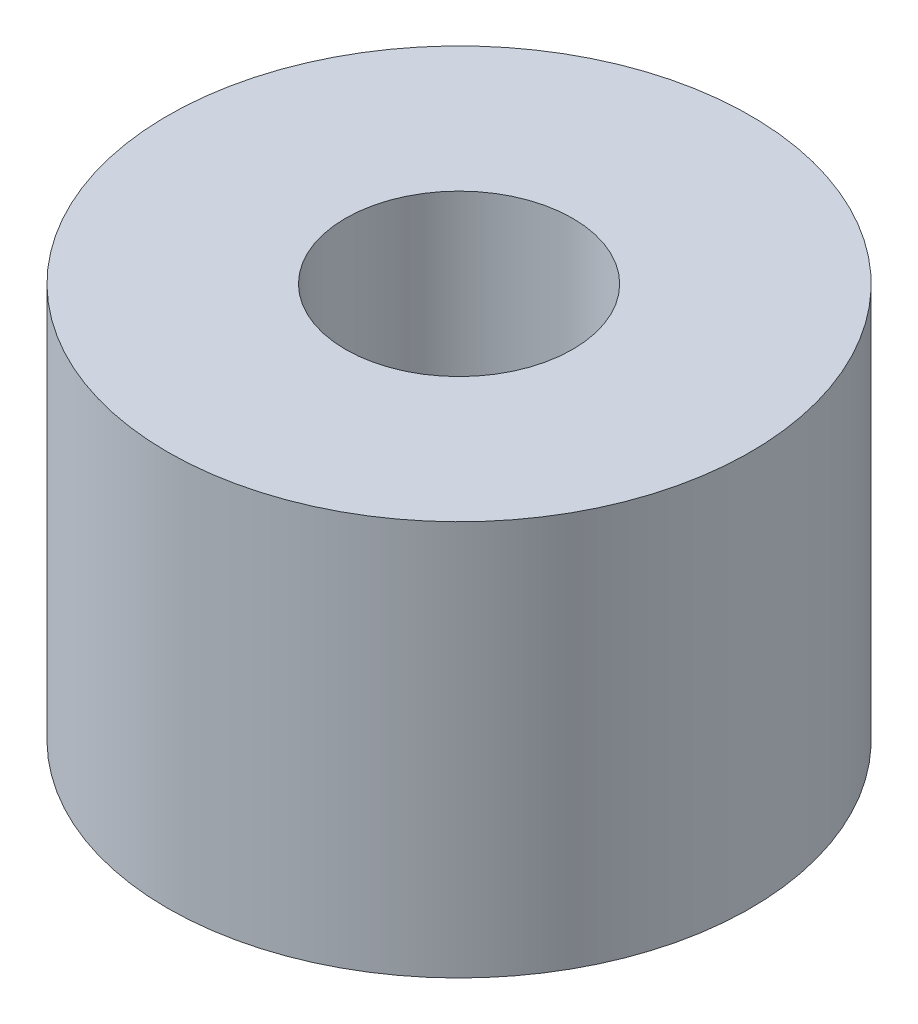
ISO-10303-21;
HEADER;
FILE_DESCRIPTION(('STEP AP214'),'2;1');
FILE_NAME('part.step','',(''),(''),'','','');
FILE_SCHEMA(('AUTOMOTIVE_DESIGN { 1 0 10303 214 1 1 1 1 }'));
ENDSEC;
DATA;
#1=APPLICATION_CONTEXT('core data for automotive mechanical design processes');
#2=APPLICATION_PROTOCOL_DEFINITION('international standard','automotive_design',2000,#1);
#3=PRODUCT_CONTEXT('',#1,'mechanical');
#4=PRODUCT('Part','Part','',(#3));
#5=PRODUCT_RELATED_PRODUCT_CATEGORY('part','',(#4));
#6=PRODUCT_DEFINITION_FORMATION('','',#4);
#7=PRODUCT_DEFINITION_CONTEXT('part definition',#1,'design');
#8=PRODUCT_DEFINITION('design','',#6,#7);
#9=PRODUCT_DEFINITION_SHAPE('','',#8);
#10=(LENGTH_UNIT() NAMED_UNIT(*) SI_UNIT(.MILLI.,.METRE.));
#11=(NAMED_UNIT(*) PLANE_ANGLE_UNIT() SI_UNIT($,.RADIAN.));
#12=(NAMED_UNIT(*) SI_UNIT($,.STERADIAN.) SOLID_ANGLE_UNIT());
#13=UNCERTAINTY_MEASURE_WITH_UNIT(LENGTH_MEASURE(1.E-05),#10,'distance_accuracy_value','');
#14=(GEOMETRIC_REPRESENTATION_CONTEXT(3) GLOBAL_UNCERTAINTY_ASSIGNED_CONTEXT((#13)) GLOBAL_UNIT_ASSIGNED_CONTEXT((#10,
#11,#12)) REPRESENTATION_CONTEXT('',''));
#15=CARTESIAN_POINT('',(0.,0.,0.));
#16=DIRECTION('',(0.,0.,1.));
#17=DIRECTION('',(1.,0.,0.));
#18=AXIS2_PLACEMENT_3D('',#15,#16,#17);
#19=CARTESIAN_POINT('',(0.,4.,0.));
#20=DIRECTION('',(0.,1.,0.));
#21=DIRECTION('',(0.,0.,1.));
#22=AXIS2_PLACEMENT_3D('',#19,#20,#21);
#23=PLANE('',#22);
#24=CARTESIAN_POINT('',(0.,4.,0.));
#25=DIRECTION('',(0.,1.,0.));
#26=DIRECTION('',(0.,0.,1.));
#27=AXIS2_PLACEMENT_3D('',#24,#25,#26);
#28=CIRCLE('',#27,2.95);
#29=CARTESIAN_POINT('',(0.,4.,2.95));
#30=VERTEX_POINT('',#29);
#31=EDGE_CURVE('E10',#30,#30,#28,.T.);
#32=ORIENTED_EDGE('',*,*,#31,.T.);
#33=EDGE_LOOP('',(#32));
#34=FACE_BOUND('',#33,.T.);
#35=CARTESIAN_POINT('',(0.,4.,0.));
#36=DIRECTION('',(0.,1.,0.));
#37=DIRECTION('',(0.,0.,1.));
#38=AXIS2_PLACEMENT_3D('',#35,#36,#37);
#39=CIRCLE('',#38,1.15);
#40=CARTESIAN_POINT('',(0.,4.,1.15));
#41=VERTEX_POINT('',#40);
#42=EDGE_CURVE('E46',#41,#41,#39,.T.);
#43=ORIENTED_EDGE('',*,*,#42,.F.);
#44=EDGE_LOOP('',(#43));
#45=FACE_BOUND('',#44,.T.);
#46=ADVANCED_FACE('F35',(#34,#45),#23,.T.);
#47=CARTESIAN_POINT('',(0.,0.,0.));
#48=DIRECTION('',(0.,1.,0.));
#49=DIRECTION('',(0.,0.,1.));
#50=AXIS2_PLACEMENT_3D('',#47,#48,#49);
#51=PLANE('',#50);
#52=CARTESIAN_POINT('',(0.,0.,0.));
#53=DIRECTION('',(0.,1.,0.));
#54=DIRECTION('',(0.,0.,1.));
#55=AXIS2_PLACEMENT_3D('',#52,#53,#54);
#56=CIRCLE('',#55,2.95);
#57=CARTESIAN_POINT('',(0.,0.,2.95));
#58=VERTEX_POINT('',#57);
#59=EDGE_CURVE('E39',#58,#58,#56,.T.);
#60=ORIENTED_EDGE('',*,*,#59,.F.);
#61=EDGE_LOOP('',(#60));
#62=FACE_BOUND('',#61,.T.);
#63=CARTESIAN_POINT('',(0.,0.,0.));
#64=DIRECTION('',(0.,1.,0.));
#65=DIRECTION('',(0.,0.,1.));
#66=AXIS2_PLACEMENT_3D('',#63,#64,#65);
#67=CIRCLE('',#66,1.15);
#68=CARTESIAN_POINT('',(0.,0.,1.15));
#69=VERTEX_POINT('',#68);
#70=EDGE_CURVE('E48',#69,#69,#67,.T.);
#71=ORIENTED_EDGE('',*,*,#70,.T.);
#72=EDGE_LOOP('',(#71));
#73=FACE_BOUND('',#72,.T.);
#74=ADVANCED_FACE('F58',(#62,#73),#51,.F.);
#75=CARTESIAN_POINT('',(0.,4.,0.));
#76=DIRECTION('',(0.,-1.,0.));
#77=DIRECTION('',(0.,0.,-1.));
#78=AXIS2_PLACEMENT_3D('',#75,#76,#77);
#79=CYLINDRICAL_SURFACE('',#78,2.95);
#80=ORIENTED_EDGE('',*,*,#31,.F.);
#81=EDGE_LOOP('',(#80));
#82=FACE_BOUND('',#81,.T.);
#83=ORIENTED_EDGE('',*,*,#59,.T.);
#84=EDGE_LOOP('',(#83));
#85=FACE_BOUND('',#84,.T.);
#86=ADVANCED_FACE('F37',(#82,#85),#79,.T.);
#87=CARTESIAN_POINT('',(0.,4.,0.));
#88=DIRECTION('',(0.,-1.,0.));
#89=DIRECTION('',(0.,0.,-1.));
#90=AXIS2_PLACEMENT_3D('',#87,#88,#89);
#91=CYLINDRICAL_SURFACE('',#90,1.15);
#92=ORIENTED_EDGE('',*,*,#42,.T.);
#93=EDGE_LOOP('',(#92));
#94=FACE_BOUND('',#93,.T.);
#95=ORIENTED_EDGE('',*,*,#70,.F.);
#96=EDGE_LOOP('',(#95));
#97=FACE_BOUND('',#96,.T.);
#98=ADVANCED_FACE('F54',(#94,#97),#91,.F.);
#99=CLOSED_SHELL('',(#46,#74,#86,#98));
#100=MANIFOLD_SOLID_BREP('B2',#99);
#101=ADVANCED_BREP_SHAPE_REPRESENTATION('',(#18,#100),#14);
#102=SHAPE_DEFINITION_REPRESENTATION(#9,#101);
ENDSEC;
END-ISO-10303-21;
